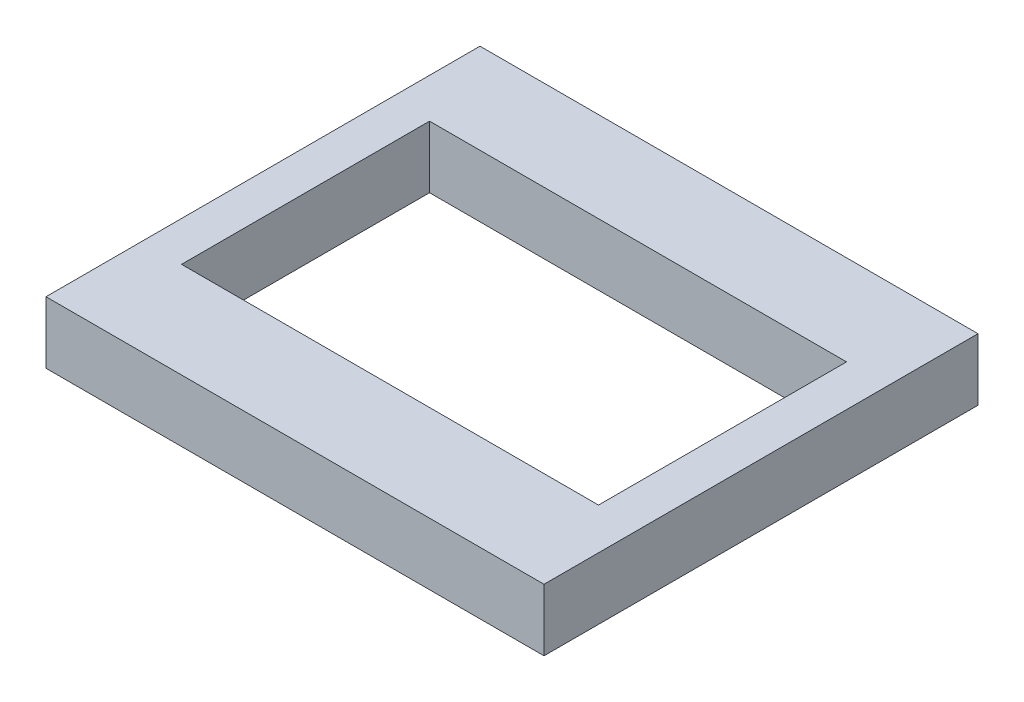
ISO-10303-21;
HEADER;
FILE_DESCRIPTION(('STEP AP214'),'2;1');
FILE_NAME('part.step','',(''),(''),'','','');
FILE_SCHEMA(('AUTOMOTIVE_DESIGN { 1 0 10303 214 1 1 1 1 }'));
ENDSEC;
DATA;
#1=APPLICATION_CONTEXT('core data for automotive mechanical design processes');
#2=APPLICATION_PROTOCOL_DEFINITION('international standard','automotive_design',2000,#1);
#3=PRODUCT_CONTEXT('',#1,'mechanical');
#4=PRODUCT('Part','Part','',(#3));
#5=PRODUCT_RELATED_PRODUCT_CATEGORY('part','',(#4));
#6=PRODUCT_DEFINITION_FORMATION('','',#4);
#7=PRODUCT_DEFINITION_CONTEXT('part definition',#1,'design');
#8=PRODUCT_DEFINITION('design','',#6,#7);
#9=PRODUCT_DEFINITION_SHAPE('','',#8);
#10=(LENGTH_UNIT() NAMED_UNIT(*) SI_UNIT(.MILLI.,.METRE.));
#11=(NAMED_UNIT(*) PLANE_ANGLE_UNIT() SI_UNIT($,.RADIAN.));
#12=(NAMED_UNIT(*) SI_UNIT($,.STERADIAN.) SOLID_ANGLE_UNIT());
#13=UNCERTAINTY_MEASURE_WITH_UNIT(LENGTH_MEASURE(1.E-05),#10,'distance_accuracy_value','');
#14=(GEOMETRIC_REPRESENTATION_CONTEXT(3) GLOBAL_UNCERTAINTY_ASSIGNED_CONTEXT((#13)) GLOBAL_UNIT_ASSIGNED_CONTEXT((#10,
#11,#12)) REPRESENTATION_CONTEXT('',''));
#15=CARTESIAN_POINT('',(0.,0.,0.));
#16=DIRECTION('',(0.,0.,1.));
#17=DIRECTION('',(1.,0.,0.));
#18=AXIS2_PLACEMENT_3D('',#15,#16,#17);
#19=CARTESIAN_POINT('',(153.02484,-19.05,-266.7));
#20=DIRECTION('',(1.,0.,0.));
#21=DIRECTION('',(0.,0.,-1.));
#22=AXIS2_PLACEMENT_3D('',#19,#20,#21);
#23=PLANE('',#22);
#24=DIRECTION('',(0.,1.,0.));
#25=VECTOR('',#24,1.);
#26=CARTESIAN_POINT('',(153.02484,-19.05,0.));
#27=LINE('',#26,#25);
#28=CARTESIAN_POINT('',(153.02484,-19.05,0.));
#29=VERTEX_POINT('',#28);
#30=CARTESIAN_POINT('',(153.02484,19.05,0.));
#31=VERTEX_POINT('',#30);
#32=EDGE_CURVE('E137',#29,#31,#27,.T.);
#33=ORIENTED_EDGE('',*,*,#32,.F.);
#34=DIRECTION('',(0.,0.,1.));
#35=VECTOR('',#34,1.);
#36=CARTESIAN_POINT('',(153.02484,-19.05,-266.7));
#37=LINE('',#36,#35);
#38=CARTESIAN_POINT('',(153.02484,-19.05,-266.7));
#39=VERTEX_POINT('',#38);
#40=EDGE_CURVE('E11',#39,#29,#37,.T.);
#41=ORIENTED_EDGE('',*,*,#40,.F.);
#42=DIRECTION('',(0.,1.,0.));
#43=VECTOR('',#42,1.);
#44=CARTESIAN_POINT('',(153.02484,-19.05,-266.7));
#45=LINE('',#44,#43);
#46=CARTESIAN_POINT('',(153.02484,19.05,-266.7));
#47=VERTEX_POINT('',#46);
#48=EDGE_CURVE('E141',#39,#47,#45,.T.);
#49=ORIENTED_EDGE('',*,*,#48,.T.);
#50=DIRECTION('',(0.,0.,1.));
#51=VECTOR('',#50,1.);
#52=CARTESIAN_POINT('',(153.02484,19.05,-266.7));
#53=LINE('',#52,#51);
#54=EDGE_CURVE('E44',#47,#31,#53,.T.);
#55=ORIENTED_EDGE('',*,*,#54,.T.);
#56=EDGE_LOOP('',(#33,#41,#49,#55));
#57=FACE_BOUND('',#56,.T.);
#58=ADVANCED_FACE('F41',(#57),#23,.T.);
#59=CARTESIAN_POINT('',(-153.02484,-19.05,-266.7));
#60=DIRECTION('',(0.,-1.,0.));
#61=DIRECTION('',(0.,0.,-1.));
#62=AXIS2_PLACEMENT_3D('',#59,#60,#61);
#63=PLANE('',#62);
#64=DIRECTION('',(1.,0.,0.));
#65=VECTOR('',#64,1.);
#66=CARTESIAN_POINT('',(0.,-19.05,-211.291612863041));
#67=LINE('',#66,#65);
#68=CARTESIAN_POINT('',(-128.618375466509,-19.05,-211.291612863041));
#69=VERTEX_POINT('',#68);
#70=CARTESIAN_POINT('',(127.62484,-19.05,-211.291612863041));
#71=VERTEX_POINT('',#70);
#72=EDGE_CURVE('E57',#69,#71,#67,.T.);
#73=ORIENTED_EDGE('',*,*,#72,.F.);
#74=DIRECTION('',(0.,0.,1.));
#75=VECTOR('',#74,1.);
#76=CARTESIAN_POINT('',(-128.618375466509,-19.05,0.));
#77=LINE('',#76,#75);
#78=CARTESIAN_POINT('',(-128.618375466509,-19.05,-58.8916128630412));
#79=VERTEX_POINT('',#78);
#80=EDGE_CURVE('E122',#69,#79,#77,.T.);
#81=ORIENTED_EDGE('',*,*,#80,.T.);
#82=DIRECTION('',(1.,0.,0.));
#83=VECTOR('',#82,1.);
#84=CARTESIAN_POINT('',(0.,-19.05,-58.8916128630412));
#85=LINE('',#84,#83);
#86=CARTESIAN_POINT('',(127.62484,-19.05,-58.8916128630412));
#87=VERTEX_POINT('',#86);
#88=EDGE_CURVE('E125',#79,#87,#85,.T.);
#89=ORIENTED_EDGE('',*,*,#88,.T.);
#90=DIRECTION('',(0.,0.,1.));
#91=VECTOR('',#90,1.);
#92=CARTESIAN_POINT('',(127.62484,-19.05,0.));
#93=LINE('',#92,#91);
#94=EDGE_CURVE('E131',#71,#87,#93,.T.);
#95=ORIENTED_EDGE('',*,*,#94,.F.);
#96=EDGE_LOOP('',(#73,#81,#89,#95));
#97=FACE_BOUND('',#96,.T.);
#98=DIRECTION('',(1.,0.,0.));
#99=VECTOR('',#98,1.);
#100=CARTESIAN_POINT('',(-153.02484,-19.05,0.));
#101=LINE('',#100,#99);
#102=CARTESIAN_POINT('',(-153.02484,-19.05,0.));
#103=VERTEX_POINT('',#102);
#104=EDGE_CURVE('E145',#103,#29,#101,.T.);
#105=ORIENTED_EDGE('',*,*,#104,.F.);
#106=DIRECTION('',(0.,0.,1.));
#107=VECTOR('',#106,1.);
#108=CARTESIAN_POINT('',(-153.02484,-19.05,-266.7));
#109=LINE('',#108,#107);
#110=CARTESIAN_POINT('',(-153.02484,-19.05,-266.7));
#111=VERTEX_POINT('',#110);
#112=EDGE_CURVE('E49',#111,#103,#109,.T.);
#113=ORIENTED_EDGE('',*,*,#112,.F.);
#114=DIRECTION('',(1.,0.,0.));
#115=VECTOR('',#114,1.);
#116=CARTESIAN_POINT('',(-153.02484,-19.05,-266.7));
#117=LINE('',#116,#115);
#118=EDGE_CURVE('E151',#111,#39,#117,.T.);
#119=ORIENTED_EDGE('',*,*,#118,.T.);
#120=ORIENTED_EDGE('',*,*,#40,.T.);
#121=EDGE_LOOP('',(#105,#113,#119,#120));
#122=FACE_BOUND('',#121,.T.);
#123=ADVANCED_FACE('F175',(#97,#122),#63,.T.);
#124=CARTESIAN_POINT('',(-153.02484,-19.05,-266.7));
#125=DIRECTION('',(-1.,0.,0.));
#126=DIRECTION('',(0.,0.,1.));
#127=AXIS2_PLACEMENT_3D('',#124,#125,#126);
#128=PLANE('',#127);
#129=DIRECTION('',(0.,-1.,0.));
#130=VECTOR('',#129,1.);
#131=CARTESIAN_POINT('',(-153.02484,-19.05,0.));
#132=LINE('',#131,#130);
#133=CARTESIAN_POINT('',(-153.02484,19.05,0.));
#134=VERTEX_POINT('',#133);
#135=EDGE_CURVE('E159',#134,#103,#132,.T.);
#136=ORIENTED_EDGE('',*,*,#135,.F.);
#137=DIRECTION('',(0.,0.,1.));
#138=VECTOR('',#137,1.);
#139=CARTESIAN_POINT('',(-153.02484,19.05,-266.7));
#140=LINE('',#139,#138);
#141=CARTESIAN_POINT('',(-153.02484,19.05,-266.7));
#142=VERTEX_POINT('',#141);
#143=EDGE_CURVE('E164',#142,#134,#140,.T.);
#144=ORIENTED_EDGE('',*,*,#143,.F.);
#145=DIRECTION('',(0.,-1.,0.));
#146=VECTOR('',#145,1.);
#147=CARTESIAN_POINT('',(-153.02484,-19.05,-266.7));
#148=LINE('',#147,#146);
#149=EDGE_CURVE('E148',#142,#111,#148,.T.);
#150=ORIENTED_EDGE('',*,*,#149,.T.);
#151=ORIENTED_EDGE('',*,*,#112,.T.);
#152=EDGE_LOOP('',(#136,#144,#150,#151));
#153=FACE_BOUND('',#152,.T.);
#154=ADVANCED_FACE('F181',(#153),#128,.T.);
#155=CARTESIAN_POINT('',(-153.02484,19.05,-266.7));
#156=DIRECTION('',(0.,1.,0.));
#157=DIRECTION('',(0.,0.,1.));
#158=AXIS2_PLACEMENT_3D('',#155,#156,#157);
#159=PLANE('',#158);
#160=DIRECTION('',(1.,0.,0.));
#161=VECTOR('',#160,1.);
#162=CARTESIAN_POINT('',(0.,19.05,-211.291612863041));
#163=LINE('',#162,#161);
#164=CARTESIAN_POINT('',(-128.618375466509,19.05,-211.291612863041));
#165=VERTEX_POINT('',#164);
#166=CARTESIAN_POINT('',(127.62484,19.05,-211.291612863041));
#167=VERTEX_POINT('',#166);
#168=EDGE_CURVE('E108',#165,#167,#163,.T.);
#169=ORIENTED_EDGE('',*,*,#168,.T.);
#170=DIRECTION('',(0.,0.,1.));
#171=VECTOR('',#170,1.);
#172=CARTESIAN_POINT('',(127.62484,19.05,0.));
#173=LINE('',#172,#171);
#174=CARTESIAN_POINT('',(127.62484,19.05,-58.8916128630412));
#175=VERTEX_POINT('',#174);
#176=EDGE_CURVE('E114',#167,#175,#173,.T.);
#177=ORIENTED_EDGE('',*,*,#176,.T.);
#178=DIRECTION('',(1.,0.,0.));
#179=VECTOR('',#178,1.);
#180=CARTESIAN_POINT('',(0.,19.05,-58.8916128630412));
#181=LINE('',#180,#179);
#182=CARTESIAN_POINT('',(-128.618375466509,19.05,-58.8916128630412));
#183=VERTEX_POINT('',#182);
#184=EDGE_CURVE('E118',#183,#175,#181,.T.);
#185=ORIENTED_EDGE('',*,*,#184,.F.);
#186=DIRECTION('',(0.,0.,1.));
#187=VECTOR('',#186,1.);
#188=CARTESIAN_POINT('',(-128.618375466509,19.05,0.));
#189=LINE('',#188,#187);
#190=EDGE_CURVE('E111',#165,#183,#189,.T.);
#191=ORIENTED_EDGE('',*,*,#190,.F.);
#192=EDGE_LOOP('',(#169,#177,#185,#191));
#193=FACE_BOUND('',#192,.T.);
#194=DIRECTION('',(-1.,0.,0.));
#195=VECTOR('',#194,1.);
#196=CARTESIAN_POINT('',(-153.02484,19.05,0.));
#197=LINE('',#196,#195);
#198=EDGE_CURVE('E156',#31,#134,#197,.T.);
#199=ORIENTED_EDGE('',*,*,#198,.F.);
#200=ORIENTED_EDGE('',*,*,#54,.F.);
#201=DIRECTION('',(-1.,0.,0.));
#202=VECTOR('',#201,1.);
#203=CARTESIAN_POINT('',(-153.02484,19.05,-266.7));
#204=LINE('',#203,#202);
#205=EDGE_CURVE('E144',#47,#142,#204,.T.);
#206=ORIENTED_EDGE('',*,*,#205,.T.);
#207=ORIENTED_EDGE('',*,*,#143,.T.);
#208=EDGE_LOOP('',(#199,#200,#206,#207));
#209=FACE_BOUND('',#208,.T.);
#210=ADVANCED_FACE('F120',(#193,#209),#159,.T.);
#211=CARTESIAN_POINT('',(0.,0.,-266.7));
#212=DIRECTION('',(0.,0.,-1.));
#213=DIRECTION('',(-1.,0.,0.));
#214=AXIS2_PLACEMENT_3D('',#211,#212,#213);
#215=PLANE('',#214);
#216=ORIENTED_EDGE('',*,*,#48,.F.);
#217=ORIENTED_EDGE('',*,*,#118,.F.);
#218=ORIENTED_EDGE('',*,*,#149,.F.);
#219=ORIENTED_EDGE('',*,*,#205,.F.);
#220=EDGE_LOOP('',(#216,#217,#218,#219));
#221=FACE_BOUND('',#220,.T.);
#222=ADVANCED_FACE('F178',(#221),#215,.T.);
#223=CARTESIAN_POINT('',(0.,0.,0.));
#224=DIRECTION('',(0.,0.,-1.));
#225=DIRECTION('',(-1.,0.,0.));
#226=AXIS2_PLACEMENT_3D('',#223,#224,#225);
#227=PLANE('',#226);
#228=ORIENTED_EDGE('',*,*,#32,.T.);
#229=ORIENTED_EDGE('',*,*,#198,.T.);
#230=ORIENTED_EDGE('',*,*,#135,.T.);
#231=ORIENTED_EDGE('',*,*,#104,.T.);
#232=EDGE_LOOP('',(#228,#229,#230,#231));
#233=FACE_BOUND('',#232,.T.);
#234=ADVANCED_FACE('F172',(#233),#227,.F.);
#235=CARTESIAN_POINT('',(0.,19.05,-211.291612863041));
#236=DIRECTION('',(0.,0.,-1.));
#237=DIRECTION('',(-1.,0.,0.));
#238=AXIS2_PLACEMENT_3D('',#235,#236,#237);
#239=PLANE('',#238);
#240=ORIENTED_EDGE('',*,*,#72,.T.);
#241=DIRECTION('',(0.,-1.,0.));
#242=VECTOR('',#241,1.);
#243=CARTESIAN_POINT('',(127.62484,19.05,-211.291612863041));
#244=LINE('',#243,#242);
#245=EDGE_CURVE('E105',#167,#71,#244,.T.);
#246=ORIENTED_EDGE('',*,*,#245,.F.);
#247=ORIENTED_EDGE('',*,*,#168,.F.);
#248=DIRECTION('',(0.,-1.,0.));
#249=VECTOR('',#248,1.);
#250=CARTESIAN_POINT('',(-128.618375466509,19.05,-211.291612863041));
#251=LINE('',#250,#249);
#252=EDGE_CURVE('E135',#165,#69,#251,.T.);
#253=ORIENTED_EDGE('',*,*,#252,.T.);
#254=EDGE_LOOP('',(#240,#246,#247,#253));
#255=FACE_BOUND('',#254,.T.);
#256=ADVANCED_FACE('F106',(#255),#239,.F.);
#257=CARTESIAN_POINT('',(-128.618375466509,19.05,0.));
#258=DIRECTION('',(1.,0.,0.));
#259=DIRECTION('',(0.,0.,-1.));
#260=AXIS2_PLACEMENT_3D('',#257,#258,#259);
#261=PLANE('',#260);
#262=ORIENTED_EDGE('',*,*,#80,.F.);
#263=ORIENTED_EDGE('',*,*,#252,.F.);
#264=ORIENTED_EDGE('',*,*,#190,.T.);
#265=DIRECTION('',(0.,-1.,0.));
#266=VECTOR('',#265,1.);
#267=CARTESIAN_POINT('',(-128.618375466509,19.05,-58.8916128630412));
#268=LINE('',#267,#266);
#269=EDGE_CURVE('E138',#183,#79,#268,.T.);
#270=ORIENTED_EDGE('',*,*,#269,.T.);
#271=EDGE_LOOP('',(#262,#263,#264,#270));
#272=FACE_BOUND('',#271,.T.);
#273=ADVANCED_FACE('F235',(#272),#261,.T.);
#274=CARTESIAN_POINT('',(0.,19.05,-58.8916128630412));
#275=DIRECTION('',(0.,0.,-1.));
#276=DIRECTION('',(-1.,0.,0.));
#277=AXIS2_PLACEMENT_3D('',#274,#275,#276);
#278=PLANE('',#277);
#279=ORIENTED_EDGE('',*,*,#88,.F.);
#280=ORIENTED_EDGE('',*,*,#269,.F.);
#281=ORIENTED_EDGE('',*,*,#184,.T.);
#282=DIRECTION('',(0.,-1.,0.));
#283=VECTOR('',#282,1.);
#284=CARTESIAN_POINT('',(127.62484,19.05,-58.8916128630412));
#285=LINE('',#284,#283);
#286=EDGE_CURVE('E65',#175,#87,#285,.T.);
#287=ORIENTED_EDGE('',*,*,#286,.T.);
#288=EDGE_LOOP('',(#279,#280,#281,#287));
#289=FACE_BOUND('',#288,.T.);
#290=ADVANCED_FACE('F244',(#289),#278,.T.);
#291=CARTESIAN_POINT('',(127.62484,19.05,0.));
#292=DIRECTION('',(1.,0.,0.));
#293=DIRECTION('',(0.,0.,-1.));
#294=AXIS2_PLACEMENT_3D('',#291,#292,#293);
#295=PLANE('',#294);
#296=ORIENTED_EDGE('',*,*,#94,.T.);
#297=ORIENTED_EDGE('',*,*,#286,.F.);
#298=ORIENTED_EDGE('',*,*,#176,.F.);
#299=ORIENTED_EDGE('',*,*,#245,.T.);
#300=EDGE_LOOP('',(#296,#297,#298,#299));
#301=FACE_BOUND('',#300,.T.);
#302=ADVANCED_FACE('F115',(#301),#295,.F.);
#303=CLOSED_SHELL('',(#58,#123,#154,#210,#222,#234,#256,#273,#290,#302));
#304=MANIFOLD_SOLID_BREP('B2',#303);
#305=ADVANCED_BREP_SHAPE_REPRESENTATION('',(#18,#304),#14);
#306=SHAPE_DEFINITION_REPRESENTATION(#9,#305);
ENDSEC;
END-ISO-10303-21;
